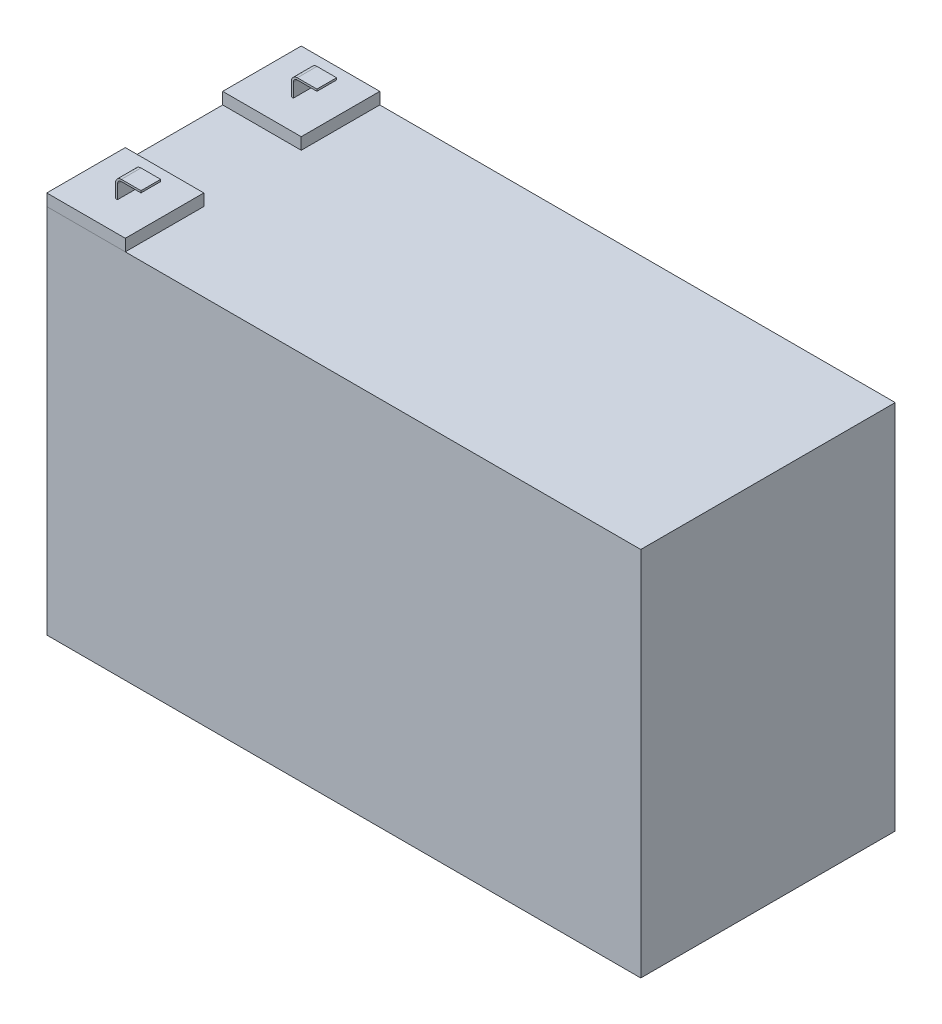
ISO-10303-21;
HEADER;
FILE_DESCRIPTION(('STEP AP214'),'2;1');
FILE_NAME('part.step','',(''),(''),'','','');
FILE_SCHEMA(('AUTOMOTIVE_DESIGN { 1 0 10303 214 1 1 1 1 }'));
ENDSEC;
DATA;
#1=APPLICATION_CONTEXT('core data for automotive mechanical design processes');
#2=APPLICATION_PROTOCOL_DEFINITION('international standard','automotive_design',2000,#1);
#3=PRODUCT_CONTEXT('',#1,'mechanical');
#4=PRODUCT('Part','Part','',(#3));
#5=PRODUCT_RELATED_PRODUCT_CATEGORY('part','',(#4));
#6=PRODUCT_DEFINITION_FORMATION('','',#4);
#7=PRODUCT_DEFINITION_CONTEXT('part definition',#1,'design');
#8=PRODUCT_DEFINITION('design','',#6,#7);
#9=PRODUCT_DEFINITION_SHAPE('','',#8);
#10=(LENGTH_UNIT() NAMED_UNIT(*) SI_UNIT(.MILLI.,.METRE.));
#11=(NAMED_UNIT(*) PLANE_ANGLE_UNIT() SI_UNIT($,.RADIAN.));
#12=(NAMED_UNIT(*) SI_UNIT($,.STERADIAN.) SOLID_ANGLE_UNIT());
#13=UNCERTAINTY_MEASURE_WITH_UNIT(LENGTH_MEASURE(1.E-05),#10,'distance_accuracy_value','');
#14=(GEOMETRIC_REPRESENTATION_CONTEXT(3) GLOBAL_UNCERTAINTY_ASSIGNED_CONTEXT((#13)) GLOBAL_UNIT_ASSIGNED_CONTEXT((#10,
#11,#12)) REPRESENTATION_CONTEXT('',''));
#15=CARTESIAN_POINT('',(0.,0.,0.));
#16=DIRECTION('',(0.,0.,1.));
#17=DIRECTION('',(1.,0.,0.));
#18=AXIS2_PLACEMENT_3D('',#15,#16,#17);
#19=CARTESIAN_POINT('',(-75.63,97.5,-32.4));
#20=DIRECTION('',(1.,0.,0.));
#21=DIRECTION('',(0.,0.,1.));
#22=AXIS2_PLACEMENT_3D('',#19,#20,#21);
#23=PLANE('',#22);
#24=DIRECTION('',(0.,0.,-1.));
#25=VECTOR('',#24,1.);
#26=CARTESIAN_POINT('',(-75.63,94.5,-32.4));
#27=LINE('',#26,#25);
#28=CARTESIAN_POINT('',(-75.63,94.5,-12.4));
#29=VERTEX_POINT('',#28);
#30=CARTESIAN_POINT('',(-75.63,94.5,-32.4));
#31=VERTEX_POINT('',#30);
#32=EDGE_CURVE('E115',#29,#31,#27,.T.);
#33=ORIENTED_EDGE('',*,*,#32,.F.);
#34=DIRECTION('',(0.,-1.,0.));
#35=VECTOR('',#34,1.);
#36=CARTESIAN_POINT('',(-75.63,97.5,-12.4));
#37=LINE('',#36,#35);
#38=CARTESIAN_POINT('',(-75.63,97.5,-12.4));
#39=VERTEX_POINT('',#38);
#40=EDGE_CURVE('E114',#39,#29,#37,.T.);
#41=ORIENTED_EDGE('',*,*,#40,.F.);
#42=DIRECTION('',(0.,0.,-1.));
#43=VECTOR('',#42,1.);
#44=CARTESIAN_POINT('',(-75.63,97.5,-32.4));
#45=LINE('',#44,#43);
#46=CARTESIAN_POINT('',(-75.63,97.5,-32.4));
#47=VERTEX_POINT('',#46);
#48=EDGE_CURVE('E109',#39,#47,#45,.T.);
#49=ORIENTED_EDGE('',*,*,#48,.T.);
#50=DIRECTION('',(0.,-1.,0.));
#51=VECTOR('',#50,1.);
#52=CARTESIAN_POINT('',(-75.63,97.5,-32.4));
#53=LINE('',#52,#51);
#54=EDGE_CURVE('E12',#47,#31,#53,.T.);
#55=ORIENTED_EDGE('',*,*,#54,.T.);
#56=EDGE_LOOP('',(#33,#41,#49,#55));
#57=FACE_BOUND('',#56,.T.);
#58=ADVANCED_FACE('F52',(#57),#23,.F.);
#59=CARTESIAN_POINT('',(-75.63,97.5,-32.4));
#60=DIRECTION('',(0.,0.,1.));
#61=DIRECTION('',(-1.,0.,0.));
#62=AXIS2_PLACEMENT_3D('',#59,#60,#61);
#63=PLANE('',#62);
#64=DIRECTION('',(1.,0.,0.));
#65=VECTOR('',#64,1.);
#66=CARTESIAN_POINT('',(-75.63,94.5,-32.4));
#67=LINE('',#66,#65);
#68=CARTESIAN_POINT('',(-55.63,94.5,-32.4));
#69=VERTEX_POINT('',#68);
#70=EDGE_CURVE('E117',#31,#69,#67,.T.);
#71=ORIENTED_EDGE('',*,*,#70,.F.);
#72=ORIENTED_EDGE('',*,*,#54,.F.);
#73=DIRECTION('',(1.,0.,0.));
#74=VECTOR('',#73,1.);
#75=CARTESIAN_POINT('',(-75.63,97.5,-32.4));
#76=LINE('',#75,#74);
#77=CARTESIAN_POINT('',(-55.63,97.5,-32.4));
#78=VERTEX_POINT('',#77);
#79=EDGE_CURVE('E93',#47,#78,#76,.T.);
#80=ORIENTED_EDGE('',*,*,#79,.T.);
#81=DIRECTION('',(0.,-1.,0.));
#82=VECTOR('',#81,1.);
#83=CARTESIAN_POINT('',(-55.63,97.5,-32.4));
#84=LINE('',#83,#82);
#85=EDGE_CURVE('E60',#78,#69,#84,.T.);
#86=ORIENTED_EDGE('',*,*,#85,.T.);
#87=EDGE_LOOP('',(#71,#72,#80,#86));
#88=FACE_BOUND('',#87,.T.);
#89=ADVANCED_FACE('F107',(#88),#63,.F.);
#90=CARTESIAN_POINT('',(-55.63,97.5,-32.4));
#91=DIRECTION('',(-1.,0.,0.));
#92=DIRECTION('',(0.,0.,-1.));
#93=AXIS2_PLACEMENT_3D('',#90,#91,#92);
#94=PLANE('',#93);
#95=DIRECTION('',(0.,0.,1.));
#96=VECTOR('',#95,1.);
#97=CARTESIAN_POINT('',(-55.63,94.5,-32.4));
#98=LINE('',#97,#96);
#99=CARTESIAN_POINT('',(-55.63,94.5,-12.4));
#100=VERTEX_POINT('',#99);
#101=EDGE_CURVE('E103',#69,#100,#98,.T.);
#102=ORIENTED_EDGE('',*,*,#101,.F.);
#103=ORIENTED_EDGE('',*,*,#85,.F.);
#104=DIRECTION('',(0.,0.,1.));
#105=VECTOR('',#104,1.);
#106=CARTESIAN_POINT('',(-55.63,97.5,-32.4));
#107=LINE('',#106,#105);
#108=CARTESIAN_POINT('',(-55.63,97.5,-12.4));
#109=VERTEX_POINT('',#108);
#110=EDGE_CURVE('E96',#78,#109,#107,.T.);
#111=ORIENTED_EDGE('',*,*,#110,.T.);
#112=DIRECTION('',(0.,-1.,0.));
#113=VECTOR('',#112,1.);
#114=CARTESIAN_POINT('',(-55.63,97.5,-12.4));
#115=LINE('',#114,#113);
#116=EDGE_CURVE('E106',#109,#100,#115,.T.);
#117=ORIENTED_EDGE('',*,*,#116,.T.);
#118=EDGE_LOOP('',(#102,#103,#111,#117));
#119=FACE_BOUND('',#118,.T.);
#120=ADVANCED_FACE('F102',(#119),#94,.F.);
#121=CARTESIAN_POINT('',(-75.63,97.5,-12.4));
#122=DIRECTION('',(0.,0.,-1.));
#123=DIRECTION('',(1.,0.,0.));
#124=AXIS2_PLACEMENT_3D('',#121,#122,#123);
#125=PLANE('',#124);
#126=DIRECTION('',(-1.,0.,0.));
#127=VECTOR('',#126,1.);
#128=CARTESIAN_POINT('',(-75.63,94.5,-12.4));
#129=LINE('',#128,#127);
#130=EDGE_CURVE('E82',#100,#29,#129,.T.);
#131=ORIENTED_EDGE('',*,*,#130,.F.);
#132=ORIENTED_EDGE('',*,*,#116,.F.);
#133=DIRECTION('',(-1.,0.,0.));
#134=VECTOR('',#133,1.);
#135=CARTESIAN_POINT('',(-75.63,97.5,-12.4));
#136=LINE('',#135,#134);
#137=EDGE_CURVE('E68',#109,#39,#136,.T.);
#138=ORIENTED_EDGE('',*,*,#137,.T.);
#139=ORIENTED_EDGE('',*,*,#40,.T.);
#140=EDGE_LOOP('',(#131,#132,#138,#139));
#141=FACE_BOUND('',#140,.T.);
#142=ADVANCED_FACE('F126',(#141),#125,.F.);
#143=CARTESIAN_POINT('',(0.,97.5,0.));
#144=DIRECTION('',(0.,-1.,0.));
#145=DIRECTION('',(0.,0.,1.));
#146=AXIS2_PLACEMENT_3D('',#143,#144,#145);
#147=PLANE('',#146);
#148=ORIENTED_EDGE('',*,*,#48,.F.);
#149=ORIENTED_EDGE('',*,*,#137,.F.);
#150=ORIENTED_EDGE('',*,*,#110,.F.);
#151=ORIENTED_EDGE('',*,*,#79,.F.);
#152=EDGE_LOOP('',(#148,#149,#150,#151));
#153=FACE_BOUND('',#152,.T.);
#154=ADVANCED_FACE('F98',(#153),#147,.F.);
#155=CARTESIAN_POINT('',(0.,94.5,0.));
#156=DIRECTION('',(0.,-1.,0.));
#157=DIRECTION('',(0.,0.,1.));
#158=AXIS2_PLACEMENT_3D('',#155,#156,#157);
#159=PLANE('',#158);
#160=ORIENTED_EDGE('',*,*,#32,.T.);
#161=ORIENTED_EDGE('',*,*,#70,.T.);
#162=ORIENTED_EDGE('',*,*,#101,.T.);
#163=ORIENTED_EDGE('',*,*,#130,.T.);
#164=EDGE_LOOP('',(#160,#161,#162,#163));
#165=FACE_BOUND('',#164,.T.);
#166=ADVANCED_FACE('F122',(#165),#159,.T.);
#167=CLOSED_SHELL('',(#58,#89,#120,#142,#154,#166));
#168=MANIFOLD_SOLID_BREP('B2',#167);
#169=CARTESIAN_POINT('',(-65.63,97.5,-19.9));
#170=DIRECTION('',(0.,-1.,0.));
#171=DIRECTION('',(0.,0.,1.));
#172=AXIS2_PLACEMENT_3D('',#169,#170,#171);
#173=PLANE('',#172);
#174=DIRECTION('',(0.,0.,-1.));
#175=VECTOR('',#174,1.);
#176=CARTESIAN_POINT('',(-65.13,97.5,-19.9));
#177=LINE('',#176,#175);
#178=CARTESIAN_POINT('',(-65.13,97.5,-19.9));
#179=VERTEX_POINT('',#178);
#180=CARTESIAN_POINT('',(-65.13,97.5,-24.9));
#181=VERTEX_POINT('',#180);
#182=EDGE_CURVE('E189',#179,#181,#177,.T.);
#183=ORIENTED_EDGE('',*,*,#182,.F.);
#184=DIRECTION('',(1.,0.,0.));
#185=VECTOR('',#184,1.);
#186=CARTESIAN_POINT('',(-65.63,97.5,-19.9));
#187=LINE('',#186,#185);
#188=CARTESIAN_POINT('',(-65.63,97.5,-19.9));
#189=VERTEX_POINT('',#188);
#190=EDGE_CURVE('E313',#189,#179,#187,.T.);
#191=ORIENTED_EDGE('',*,*,#190,.F.);
#192=DIRECTION('',(0.,0.,-1.));
#193=VECTOR('',#192,1.);
#194=CARTESIAN_POINT('',(-65.63,97.5,-19.9));
#195=LINE('',#194,#193);
#196=CARTESIAN_POINT('',(-65.63,97.5,-24.9));
#197=VERTEX_POINT('',#196);
#198=EDGE_CURVE('E50',#189,#197,#195,.T.);
#199=ORIENTED_EDGE('',*,*,#198,.T.);
#200=DIRECTION('',(1.,0.,0.));
#201=VECTOR('',#200,1.);
#202=CARTESIAN_POINT('',(-65.63,97.5,-24.9));
#203=LINE('',#202,#201);
#204=EDGE_CURVE('E256',#197,#181,#203,.T.);
#205=ORIENTED_EDGE('',*,*,#204,.T.);
#206=EDGE_LOOP('',(#183,#191,#199,#205));
#207=FACE_BOUND('',#206,.T.);
#208=ADVANCED_FACE('F186',(#207),#173,.T.);
#209=CARTESIAN_POINT('',(-65.63,97.5,-19.9));
#210=DIRECTION('',(-1.,0.,0.));
#211=DIRECTION('',(0.,0.,-1.));
#212=AXIS2_PLACEMENT_3D('',#209,#210,#211);
#213=PLANE('',#212);
#214=ORIENTED_EDGE('',*,*,#198,.F.);
#215=DIRECTION('',(0.,-1.,0.));
#216=VECTOR('',#215,1.);
#217=CARTESIAN_POINT('',(-65.63,97.5,-19.9));
#218=LINE('',#217,#216);
#219=CARTESIAN_POINT('',(-65.63,101.,-19.9));
#220=VERTEX_POINT('',#219);
#221=EDGE_CURVE('E202',#220,#189,#218,.T.);
#222=ORIENTED_EDGE('',*,*,#221,.F.);
#223=DIRECTION('',(0.,0.,-1.));
#224=VECTOR('',#223,1.);
#225=CARTESIAN_POINT('',(-65.63,101.,-19.9));
#226=LINE('',#225,#224);
#227=CARTESIAN_POINT('',(-65.63,101.,-24.9));
#228=VERTEX_POINT('',#227);
#229=EDGE_CURVE('E194',#220,#228,#226,.T.);
#230=ORIENTED_EDGE('',*,*,#229,.T.);
#231=DIRECTION('',(0.,-1.,0.));
#232=VECTOR('',#231,1.);
#233=CARTESIAN_POINT('',(-65.63,97.5,-24.9));
#234=LINE('',#233,#232);
#235=EDGE_CURVE('E311',#228,#197,#234,.T.);
#236=ORIENTED_EDGE('',*,*,#235,.T.);
#237=EDGE_LOOP('',(#214,#222,#230,#236));
#238=FACE_BOUND('',#237,.T.);
#239=ADVANCED_FACE('F330',(#238),#213,.T.);
#240=CARTESIAN_POINT('',(-64.13,101.,-19.9));
#241=DIRECTION('',(0.,0.,-1.));
#242=DIRECTION('',(1.,0.,0.));
#243=AXIS2_PLACEMENT_3D('',#240,#241,#242);
#244=CYLINDRICAL_SURFACE('',#243,1.49999999999999);
#245=ORIENTED_EDGE('',*,*,#229,.F.);
#246=CARTESIAN_POINT('',(-64.13,101.,-19.9));
#247=DIRECTION('',(0.,0.,1.));
#248=DIRECTION('',(-1.,0.,0.));
#249=AXIS2_PLACEMENT_3D('',#246,#247,#248);
#250=CIRCLE('',#249,1.49999999999999);
#251=CARTESIAN_POINT('',(-64.13,102.5,-19.9));
#252=VERTEX_POINT('',#251);
#253=EDGE_CURVE('E207',#252,#220,#250,.T.);
#254=ORIENTED_EDGE('',*,*,#253,.F.);
#255=DIRECTION('',(0.,0.,-1.));
#256=VECTOR('',#255,1.);
#257=CARTESIAN_POINT('',(-64.13,102.5,-19.9));
#258=LINE('',#257,#256);
#259=CARTESIAN_POINT('',(-64.13,102.5,-24.9));
#260=VERTEX_POINT('',#259);
#261=EDGE_CURVE('E279',#252,#260,#258,.T.);
#262=ORIENTED_EDGE('',*,*,#261,.T.);
#263=CARTESIAN_POINT('',(-64.13,101.,-24.9));
#264=DIRECTION('',(0.,0.,1.));
#265=DIRECTION('',(-1.,0.,0.));
#266=AXIS2_PLACEMENT_3D('',#263,#264,#265);
#267=CIRCLE('',#266,1.49999999999999);
#268=EDGE_CURVE('E309',#260,#228,#267,.T.);
#269=ORIENTED_EDGE('',*,*,#268,.T.);
#270=EDGE_LOOP('',(#245,#254,#262,#269));
#271=FACE_BOUND('',#270,.T.);
#272=ADVANCED_FACE('F328',(#271),#244,.T.);
#273=CARTESIAN_POINT('',(-64.13,102.5,-19.9));
#274=DIRECTION('',(0.,1.,0.));
#275=DIRECTION('',(-1.,0.,0.));
#276=AXIS2_PLACEMENT_3D('',#273,#274,#275);
#277=PLANE('',#276);
#278=ORIENTED_EDGE('',*,*,#261,.F.);
#279=DIRECTION('',(-1.,0.,0.));
#280=VECTOR('',#279,1.);
#281=CARTESIAN_POINT('',(-64.13,102.5,-19.9));
#282=LINE('',#281,#280);
#283=CARTESIAN_POINT('',(-59.13,102.5,-19.9));
#284=VERTEX_POINT('',#283);
#285=EDGE_CURVE('E273',#284,#252,#282,.T.);
#286=ORIENTED_EDGE('',*,*,#285,.F.);
#287=DIRECTION('',(0.,0.,-1.));
#288=VECTOR('',#287,1.);
#289=CARTESIAN_POINT('',(-59.13,102.5,-19.9));
#290=LINE('',#289,#288);
#291=CARTESIAN_POINT('',(-59.13,102.5,-24.9));
#292=VERTEX_POINT('',#291);
#293=EDGE_CURVE('E282',#284,#292,#290,.T.);
#294=ORIENTED_EDGE('',*,*,#293,.T.);
#295=DIRECTION('',(-1.,0.,0.));
#296=VECTOR('',#295,1.);
#297=CARTESIAN_POINT('',(-64.13,102.5,-24.9));
#298=LINE('',#297,#296);
#299=EDGE_CURVE('E305',#292,#260,#298,.T.);
#300=ORIENTED_EDGE('',*,*,#299,.T.);
#301=EDGE_LOOP('',(#278,#286,#294,#300));
#302=FACE_BOUND('',#301,.T.);
#303=ADVANCED_FACE('F325',(#302),#277,.T.);
#304=CARTESIAN_POINT('',(-59.13,102.5,-19.9));
#305=DIRECTION('',(1.,0.,0.));
#306=DIRECTION('',(0.,0.,1.));
#307=AXIS2_PLACEMENT_3D('',#304,#305,#306);
#308=PLANE('',#307);
#309=ORIENTED_EDGE('',*,*,#293,.F.);
#310=DIRECTION('',(0.,1.,0.));
#311=VECTOR('',#310,1.);
#312=CARTESIAN_POINT('',(-59.13,102.5,-19.9));
#313=LINE('',#312,#311);
#314=CARTESIAN_POINT('',(-59.13,102.,-19.9));
#315=VERTEX_POINT('',#314);
#316=EDGE_CURVE('E318',#315,#284,#313,.T.);
#317=ORIENTED_EDGE('',*,*,#316,.F.);
#318=DIRECTION('',(0.,0.,-1.));
#319=VECTOR('',#318,1.);
#320=CARTESIAN_POINT('',(-59.13,102.,-19.9));
#321=LINE('',#320,#319);
#322=CARTESIAN_POINT('',(-59.13,102.,-24.9));
#323=VERTEX_POINT('',#322);
#324=EDGE_CURVE('E285',#315,#323,#321,.T.);
#325=ORIENTED_EDGE('',*,*,#324,.T.);
#326=DIRECTION('',(0.,1.,0.));
#327=VECTOR('',#326,1.);
#328=CARTESIAN_POINT('',(-59.13,102.5,-24.9));
#329=LINE('',#328,#327);
#330=EDGE_CURVE('E303',#323,#292,#329,.T.);
#331=ORIENTED_EDGE('',*,*,#330,.T.);
#332=EDGE_LOOP('',(#309,#317,#325,#331));
#333=FACE_BOUND('',#332,.T.);
#334=ADVANCED_FACE('F332',(#333),#308,.T.);
#335=CARTESIAN_POINT('',(-64.13,102.,-19.9));
#336=DIRECTION('',(0.,-1.,0.));
#337=DIRECTION('',(0.,0.,1.));
#338=AXIS2_PLACEMENT_3D('',#335,#336,#337);
#339=PLANE('',#338);
#340=ORIENTED_EDGE('',*,*,#324,.F.);
#341=DIRECTION('',(1.,0.,0.));
#342=VECTOR('',#341,1.);
#343=CARTESIAN_POINT('',(-64.13,102.,-19.9));
#344=LINE('',#343,#342);
#345=CARTESIAN_POINT('',(-64.13,102.,-19.9));
#346=VERTEX_POINT('',#345);
#347=EDGE_CURVE('E296',#346,#315,#344,.T.);
#348=ORIENTED_EDGE('',*,*,#347,.F.);
#349=DIRECTION('',(0.,0.,-1.));
#350=VECTOR('',#349,1.);
#351=CARTESIAN_POINT('',(-64.13,102.,-19.9));
#352=LINE('',#351,#350);
#353=CARTESIAN_POINT('',(-64.13,102.,-24.9));
#354=VERTEX_POINT('',#353);
#355=EDGE_CURVE('E271',#346,#354,#352,.T.);
#356=ORIENTED_EDGE('',*,*,#355,.T.);
#357=DIRECTION('',(1.,0.,0.));
#358=VECTOR('',#357,1.);
#359=CARTESIAN_POINT('',(-64.13,102.,-24.9));
#360=LINE('',#359,#358);
#361=EDGE_CURVE('E294',#354,#323,#360,.T.);
#362=ORIENTED_EDGE('',*,*,#361,.T.);
#363=EDGE_LOOP('',(#340,#348,#356,#362));
#364=FACE_BOUND('',#363,.T.);
#365=ADVANCED_FACE('F293',(#364),#339,.T.);
#366=CARTESIAN_POINT('',(-64.13,101.,-19.9));
#367=DIRECTION('',(0.,0.,-1.));
#368=DIRECTION('',(1.,0.,0.));
#369=AXIS2_PLACEMENT_3D('',#366,#367,#368);
#370=CYLINDRICAL_SURFACE('',#369,1.);
#371=ORIENTED_EDGE('',*,*,#355,.F.);
#372=CARTESIAN_POINT('',(-64.13,101.,-19.9));
#373=DIRECTION('',(0.,0.,-1.));
#374=DIRECTION('',(-1.,0.,0.));
#375=AXIS2_PLACEMENT_3D('',#372,#373,#374);
#376=CIRCLE('',#375,1.);
#377=CARTESIAN_POINT('',(-65.13,101.,-19.9));
#378=VERTEX_POINT('',#377);
#379=EDGE_CURVE('E300',#378,#346,#376,.T.);
#380=ORIENTED_EDGE('',*,*,#379,.F.);
#381=DIRECTION('',(0.,0.,-1.));
#382=VECTOR('',#381,1.);
#383=CARTESIAN_POINT('',(-65.13,101.,-19.9));
#384=LINE('',#383,#382);
#385=CARTESIAN_POINT('',(-65.13,101.,-24.9));
#386=VERTEX_POINT('',#385);
#387=EDGE_CURVE('E270',#378,#386,#384,.T.);
#388=ORIENTED_EDGE('',*,*,#387,.T.);
#389=CARTESIAN_POINT('',(-64.13,101.,-24.9));
#390=DIRECTION('',(0.,0.,-1.));
#391=DIRECTION('',(-1.,0.,0.));
#392=AXIS2_PLACEMENT_3D('',#389,#390,#391);
#393=CIRCLE('',#392,1.);
#394=EDGE_CURVE('E258',#386,#354,#393,.T.);
#395=ORIENTED_EDGE('',*,*,#394,.T.);
#396=EDGE_LOOP('',(#371,#380,#388,#395));
#397=FACE_BOUND('',#396,.T.);
#398=ADVANCED_FACE('F299',(#397),#370,.F.);
#399=CARTESIAN_POINT('',(-65.13,97.5,-19.9));
#400=DIRECTION('',(1.,0.,0.));
#401=DIRECTION('',(0.,0.,1.));
#402=AXIS2_PLACEMENT_3D('',#399,#400,#401);
#403=PLANE('',#402);
#404=ORIENTED_EDGE('',*,*,#387,.F.);
#405=DIRECTION('',(0.,1.,0.));
#406=VECTOR('',#405,1.);
#407=CARTESIAN_POINT('',(-65.13,97.5,-19.9));
#408=LINE('',#407,#406);
#409=EDGE_CURVE('E269',#179,#378,#408,.T.);
#410=ORIENTED_EDGE('',*,*,#409,.F.);
#411=ORIENTED_EDGE('',*,*,#182,.T.);
#412=DIRECTION('',(0.,1.,0.));
#413=VECTOR('',#412,1.);
#414=CARTESIAN_POINT('',(-65.13,97.5,-24.9));
#415=LINE('',#414,#413);
#416=EDGE_CURVE('E252',#181,#386,#415,.T.);
#417=ORIENTED_EDGE('',*,*,#416,.T.);
#418=EDGE_LOOP('',(#404,#410,#411,#417));
#419=FACE_BOUND('',#418,.T.);
#420=ADVANCED_FACE('F268',(#419),#403,.T.);
#421=CARTESIAN_POINT('',(-64.13,101.,-19.9));
#422=DIRECTION('',(0.,0.,1.));
#423=DIRECTION('',(-1.,0.,0.));
#424=AXIS2_PLACEMENT_3D('',#421,#422,#423);
#425=PLANE('',#424);
#426=ORIENTED_EDGE('',*,*,#190,.T.);
#427=ORIENTED_EDGE('',*,*,#409,.T.);
#428=ORIENTED_EDGE('',*,*,#379,.T.);
#429=ORIENTED_EDGE('',*,*,#347,.T.);
#430=ORIENTED_EDGE('',*,*,#316,.T.);
#431=ORIENTED_EDGE('',*,*,#285,.T.);
#432=ORIENTED_EDGE('',*,*,#253,.T.);
#433=ORIENTED_EDGE('',*,*,#221,.T.);
#434=EDGE_LOOP('',(#426,#427,#428,#429,#430,#431,#432,#433));
#435=FACE_BOUND('',#434,.T.);
#436=ADVANCED_FACE('F321',(#435),#425,.T.);
#437=CARTESIAN_POINT('',(-64.13,101.,-24.9));
#438=DIRECTION('',(0.,0.,1.));
#439=DIRECTION('',(-1.,0.,0.));
#440=AXIS2_PLACEMENT_3D('',#437,#438,#439);
#441=PLANE('',#440);
#442=ORIENTED_EDGE('',*,*,#204,.F.);
#443=ORIENTED_EDGE('',*,*,#235,.F.);
#444=ORIENTED_EDGE('',*,*,#268,.F.);
#445=ORIENTED_EDGE('',*,*,#299,.F.);
#446=ORIENTED_EDGE('',*,*,#330,.F.);
#447=ORIENTED_EDGE('',*,*,#361,.F.);
#448=ORIENTED_EDGE('',*,*,#394,.F.);
#449=ORIENTED_EDGE('',*,*,#416,.F.);
#450=EDGE_LOOP('',(#442,#443,#444,#445,#446,#447,#448,#449));
#451=FACE_BOUND('',#450,.T.);
#452=ADVANCED_FACE('F254',(#451),#441,.F.);
#453=CLOSED_SHELL('',(#208,#239,#272,#303,#334,#365,#398,#420,#436,#452));
#454=MANIFOLD_SOLID_BREP('B6',#453);
#455=CARTESIAN_POINT('',(-65.63,97.5,19.9));
#456=DIRECTION('',(0.,-1.,0.));
#457=DIRECTION('',(0.,0.,-1.));
#458=AXIS2_PLACEMENT_3D('',#455,#456,#457);
#459=PLANE('',#458);
#460=DIRECTION('',(0.,0.,1.));
#461=VECTOR('',#460,1.);
#462=CARTESIAN_POINT('',(-65.13,97.5,19.9));
#463=LINE('',#462,#461);
#464=CARTESIAN_POINT('',(-65.13,97.5,19.9));
#465=VERTEX_POINT('',#464);
#466=CARTESIAN_POINT('',(-65.13,97.5,24.9));
#467=VERTEX_POINT('',#466);
#468=EDGE_CURVE('E427',#465,#467,#463,.T.);
#469=ORIENTED_EDGE('',*,*,#468,.T.);
#470=DIRECTION('',(1.,0.,0.));
#471=VECTOR('',#470,1.);
#472=CARTESIAN_POINT('',(-65.63,97.5,24.9));
#473=LINE('',#472,#471);
#474=CARTESIAN_POINT('',(-65.63,97.5,24.9));
#475=VERTEX_POINT('',#474);
#476=EDGE_CURVE('E488',#475,#467,#473,.T.);
#477=ORIENTED_EDGE('',*,*,#476,.F.);
#478=DIRECTION('',(0.,0.,1.));
#479=VECTOR('',#478,1.);
#480=CARTESIAN_POINT('',(-65.63,97.5,19.9));
#481=LINE('',#480,#479);
#482=CARTESIAN_POINT('',(-65.63,97.5,19.9));
#483=VERTEX_POINT('',#482);
#484=EDGE_CURVE('E184',#483,#475,#481,.T.);
#485=ORIENTED_EDGE('',*,*,#484,.F.);
#486=DIRECTION('',(1.,0.,0.));
#487=VECTOR('',#486,1.);
#488=CARTESIAN_POINT('',(-65.63,97.5,19.9));
#489=LINE('',#488,#487);
#490=EDGE_CURVE('E489',#483,#465,#489,.T.);
#491=ORIENTED_EDGE('',*,*,#490,.T.);
#492=EDGE_LOOP('',(#469,#477,#485,#491));
#493=FACE_BOUND('',#492,.T.);
#494=ADVANCED_FACE('F424',(#493),#459,.T.);
#495=CARTESIAN_POINT('',(-65.63,97.5,19.9));
#496=DIRECTION('',(-1.,0.,0.));
#497=DIRECTION('',(0.,0.,1.));
#498=AXIS2_PLACEMENT_3D('',#495,#496,#497);
#499=PLANE('',#498);
#500=ORIENTED_EDGE('',*,*,#484,.T.);
#501=DIRECTION('',(0.,-1.,0.));
#502=VECTOR('',#501,1.);
#503=CARTESIAN_POINT('',(-65.63,97.5,24.9));
#504=LINE('',#503,#502);
#505=CARTESIAN_POINT('',(-65.63,101.,24.9));
#506=VERTEX_POINT('',#505);
#507=EDGE_CURVE('E506',#506,#475,#504,.T.);
#508=ORIENTED_EDGE('',*,*,#507,.F.);
#509=DIRECTION('',(0.,0.,1.));
#510=VECTOR('',#509,1.);
#511=CARTESIAN_POINT('',(-65.63,101.,19.9));
#512=LINE('',#511,#510);
#513=CARTESIAN_POINT('',(-65.63,101.,19.9));
#514=VERTEX_POINT('',#513);
#515=EDGE_CURVE('E432',#514,#506,#512,.T.);
#516=ORIENTED_EDGE('',*,*,#515,.F.);
#517=DIRECTION('',(0.,-1.,0.));
#518=VECTOR('',#517,1.);
#519=CARTESIAN_POINT('',(-65.63,97.5,19.9));
#520=LINE('',#519,#518);
#521=EDGE_CURVE('E494',#514,#483,#520,.T.);
#522=ORIENTED_EDGE('',*,*,#521,.T.);
#523=EDGE_LOOP('',(#500,#508,#516,#522));
#524=FACE_BOUND('',#523,.T.);
#525=ADVANCED_FACE('F570',(#524),#499,.T.);
#526=CARTESIAN_POINT('',(-64.13,101.,19.9));
#527=DIRECTION('',(0.,0.,1.));
#528=DIRECTION('',(1.,0.,0.));
#529=AXIS2_PLACEMENT_3D('',#526,#527,#528);
#530=CYLINDRICAL_SURFACE('',#529,1.49999999999999);
#531=ORIENTED_EDGE('',*,*,#515,.T.);
#532=CARTESIAN_POINT('',(-64.13,101.,24.9));
#533=DIRECTION('',(0.,0.,1.));
#534=DIRECTION('',(-1.,0.,0.));
#535=AXIS2_PLACEMENT_3D('',#532,#533,#534);
#536=CIRCLE('',#535,1.49999999999999);
#537=CARTESIAN_POINT('',(-64.13,102.5,24.9));
#538=VERTEX_POINT('',#537);
#539=EDGE_CURVE('E519',#538,#506,#536,.T.);
#540=ORIENTED_EDGE('',*,*,#539,.F.);
#541=DIRECTION('',(0.,0.,1.));
#542=VECTOR('',#541,1.);
#543=CARTESIAN_POINT('',(-64.13,102.5,19.9));
#544=LINE('',#543,#542);
#545=CARTESIAN_POINT('',(-64.13,102.5,19.9));
#546=VERTEX_POINT('',#545);
#547=EDGE_CURVE('E541',#546,#538,#544,.T.);
#548=ORIENTED_EDGE('',*,*,#547,.F.);
#549=CARTESIAN_POINT('',(-64.13,101.,19.9));
#550=DIRECTION('',(0.,0.,1.));
#551=DIRECTION('',(-1.,0.,0.));
#552=AXIS2_PLACEMENT_3D('',#549,#550,#551);
#553=CIRCLE('',#552,1.49999999999999);
#554=EDGE_CURVE('E537',#546,#514,#553,.T.);
#555=ORIENTED_EDGE('',*,*,#554,.T.);
#556=EDGE_LOOP('',(#531,#540,#548,#555));
#557=FACE_BOUND('',#556,.T.);
#558=ADVANCED_FACE('F569',(#557),#530,.T.);
#559=CARTESIAN_POINT('',(-64.13,102.5,19.9));
#560=DIRECTION('',(0.,1.,0.));
#561=DIRECTION('',(-1.,0.,0.));
#562=AXIS2_PLACEMENT_3D('',#559,#560,#561);
#563=PLANE('',#562);
#564=ORIENTED_EDGE('',*,*,#547,.T.);
#565=DIRECTION('',(-1.,0.,0.));
#566=VECTOR('',#565,1.);
#567=CARTESIAN_POINT('',(-64.13,102.5,24.9));
#568=LINE('',#567,#566);
#569=CARTESIAN_POINT('',(-59.13,102.5,24.9));
#570=VERTEX_POINT('',#569);
#571=EDGE_CURVE('E516',#570,#538,#568,.T.);
#572=ORIENTED_EDGE('',*,*,#571,.F.);
#573=DIRECTION('',(0.,0.,1.));
#574=VECTOR('',#573,1.);
#575=CARTESIAN_POINT('',(-59.13,102.5,19.9));
#576=LINE('',#575,#574);
#577=CARTESIAN_POINT('',(-59.13,102.5,19.9));
#578=VERTEX_POINT('',#577);
#579=EDGE_CURVE('E543',#578,#570,#576,.T.);
#580=ORIENTED_EDGE('',*,*,#579,.F.);
#581=DIRECTION('',(-1.,0.,0.));
#582=VECTOR('',#581,1.);
#583=CARTESIAN_POINT('',(-64.13,102.5,19.9));
#584=LINE('',#583,#582);
#585=EDGE_CURVE('E534',#578,#546,#584,.T.);
#586=ORIENTED_EDGE('',*,*,#585,.T.);
#587=EDGE_LOOP('',(#564,#572,#580,#586));
#588=FACE_BOUND('',#587,.T.);
#589=ADVANCED_FACE('F565',(#588),#563,.T.);
#590=CARTESIAN_POINT('',(-59.13,102.5,19.9));
#591=DIRECTION('',(1.,0.,0.));
#592=DIRECTION('',(0.,0.,-1.));
#593=AXIS2_PLACEMENT_3D('',#590,#591,#592);
#594=PLANE('',#593);
#595=ORIENTED_EDGE('',*,*,#579,.T.);
#596=DIRECTION('',(0.,1.,0.));
#597=VECTOR('',#596,1.);
#598=CARTESIAN_POINT('',(-59.13,102.5,24.9));
#599=LINE('',#598,#597);
#600=CARTESIAN_POINT('',(-59.13,102.,24.9));
#601=VERTEX_POINT('',#600);
#602=EDGE_CURVE('E513',#601,#570,#599,.T.);
#603=ORIENTED_EDGE('',*,*,#602,.F.);
#604=DIRECTION('',(0.,0.,1.));
#605=VECTOR('',#604,1.);
#606=CARTESIAN_POINT('',(-59.13,102.,19.9));
#607=LINE('',#606,#605);
#608=CARTESIAN_POINT('',(-59.13,102.,19.9));
#609=VERTEX_POINT('',#608);
#610=EDGE_CURVE('E545',#609,#601,#607,.T.);
#611=ORIENTED_EDGE('',*,*,#610,.F.);
#612=DIRECTION('',(0.,1.,0.));
#613=VECTOR('',#612,1.);
#614=CARTESIAN_POINT('',(-59.13,102.5,19.9));
#615=LINE('',#614,#613);
#616=EDGE_CURVE('E531',#609,#578,#615,.T.);
#617=ORIENTED_EDGE('',*,*,#616,.T.);
#618=EDGE_LOOP('',(#595,#603,#611,#617));
#619=FACE_BOUND('',#618,.T.);
#620=ADVANCED_FACE('F558',(#619),#594,.T.);
#621=CARTESIAN_POINT('',(-64.13,102.,19.9));
#622=DIRECTION('',(0.,-1.,0.));
#623=DIRECTION('',(0.,0.,-1.));
#624=AXIS2_PLACEMENT_3D('',#621,#622,#623);
#625=PLANE('',#624);
#626=ORIENTED_EDGE('',*,*,#610,.T.);
#627=DIRECTION('',(1.,0.,0.));
#628=VECTOR('',#627,1.);
#629=CARTESIAN_POINT('',(-64.13,102.,24.9));
#630=LINE('',#629,#628);
#631=CARTESIAN_POINT('',(-64.13,102.,24.9));
#632=VERTEX_POINT('',#631);
#633=EDGE_CURVE('E510',#632,#601,#630,.T.);
#634=ORIENTED_EDGE('',*,*,#633,.F.);
#635=DIRECTION('',(0.,0.,1.));
#636=VECTOR('',#635,1.);
#637=CARTESIAN_POINT('',(-64.13,102.,19.9));
#638=LINE('',#637,#636);
#639=CARTESIAN_POINT('',(-64.13,102.,19.9));
#640=VERTEX_POINT('',#639);
#641=EDGE_CURVE('E547',#640,#632,#638,.T.);
#642=ORIENTED_EDGE('',*,*,#641,.F.);
#643=DIRECTION('',(1.,0.,0.));
#644=VECTOR('',#643,1.);
#645=CARTESIAN_POINT('',(-64.13,102.,19.9));
#646=LINE('',#645,#644);
#647=EDGE_CURVE('E528',#640,#609,#646,.T.);
#648=ORIENTED_EDGE('',*,*,#647,.T.);
#649=EDGE_LOOP('',(#626,#634,#642,#648));
#650=FACE_BOUND('',#649,.T.);
#651=ADVANCED_FACE('F555',(#650),#625,.T.);
#652=CARTESIAN_POINT('',(-64.13,101.,19.9));
#653=DIRECTION('',(0.,0.,1.));
#654=DIRECTION('',(1.,0.,0.));
#655=AXIS2_PLACEMENT_3D('',#652,#653,#654);
#656=CYLINDRICAL_SURFACE('',#655,1.);
#657=ORIENTED_EDGE('',*,*,#641,.T.);
#658=CARTESIAN_POINT('',(-64.13,101.,24.9));
#659=DIRECTION('',(0.,0.,-1.));
#660=DIRECTION('',(-1.,0.,0.));
#661=AXIS2_PLACEMENT_3D('',#658,#659,#660);
#662=CIRCLE('',#661,1.);
#663=CARTESIAN_POINT('',(-65.13,101.,24.9));
#664=VERTEX_POINT('',#663);
#665=EDGE_CURVE('E501',#664,#632,#662,.T.);
#666=ORIENTED_EDGE('',*,*,#665,.F.);
#667=DIRECTION('',(0.,0.,1.));
#668=VECTOR('',#667,1.);
#669=CARTESIAN_POINT('',(-65.13,101.,19.9));
#670=LINE('',#669,#668);
#671=CARTESIAN_POINT('',(-65.13,101.,19.9));
#672=VERTEX_POINT('',#671);
#673=EDGE_CURVE('E493',#672,#664,#670,.T.);
#674=ORIENTED_EDGE('',*,*,#673,.F.);
#675=CARTESIAN_POINT('',(-64.13,101.,19.9));
#676=DIRECTION('',(0.,0.,-1.));
#677=DIRECTION('',(-1.,0.,0.));
#678=AXIS2_PLACEMENT_3D('',#675,#676,#677);
#679=CIRCLE('',#678,1.);
#680=EDGE_CURVE('E525',#672,#640,#679,.T.);
#681=ORIENTED_EDGE('',*,*,#680,.T.);
#682=EDGE_LOOP('',(#657,#666,#674,#681));
#683=FACE_BOUND('',#682,.T.);
#684=ADVANCED_FACE('F549',(#683),#656,.F.);
#685=CARTESIAN_POINT('',(-65.13,97.5,19.9));
#686=DIRECTION('',(1.,0.,0.));
#687=DIRECTION('',(0.,0.,-1.));
#688=AXIS2_PLACEMENT_3D('',#685,#686,#687);
#689=PLANE('',#688);
#690=ORIENTED_EDGE('',*,*,#673,.T.);
#691=DIRECTION('',(0.,1.,0.));
#692=VECTOR('',#691,1.);
#693=CARTESIAN_POINT('',(-65.13,97.5,24.9));
#694=LINE('',#693,#692);
#695=EDGE_CURVE('E496',#467,#664,#694,.T.);
#696=ORIENTED_EDGE('',*,*,#695,.F.);
#697=ORIENTED_EDGE('',*,*,#468,.F.);
#698=DIRECTION('',(0.,1.,0.));
#699=VECTOR('',#698,1.);
#700=CARTESIAN_POINT('',(-65.13,97.5,19.9));
#701=LINE('',#700,#699);
#702=EDGE_CURVE('E523',#465,#672,#701,.T.);
#703=ORIENTED_EDGE('',*,*,#702,.T.);
#704=EDGE_LOOP('',(#690,#696,#697,#703));
#705=FACE_BOUND('',#704,.T.);
#706=ADVANCED_FACE('F497',(#705),#689,.T.);
#707=CARTESIAN_POINT('',(-64.13,101.,19.9));
#708=DIRECTION('',(0.,0.,-1.));
#709=DIRECTION('',(-1.,0.,0.));
#710=AXIS2_PLACEMENT_3D('',#707,#708,#709);
#711=PLANE('',#710);
#712=ORIENTED_EDGE('',*,*,#490,.F.);
#713=ORIENTED_EDGE('',*,*,#521,.F.);
#714=ORIENTED_EDGE('',*,*,#554,.F.);
#715=ORIENTED_EDGE('',*,*,#585,.F.);
#716=ORIENTED_EDGE('',*,*,#616,.F.);
#717=ORIENTED_EDGE('',*,*,#647,.F.);
#718=ORIENTED_EDGE('',*,*,#680,.F.);
#719=ORIENTED_EDGE('',*,*,#702,.F.);
#720=EDGE_LOOP('',(#712,#713,#714,#715,#716,#717,#718,#719));
#721=FACE_BOUND('',#720,.T.);
#722=ADVANCED_FACE('F561',(#721),#711,.T.);
#723=CARTESIAN_POINT('',(-64.13,101.,24.9));
#724=DIRECTION('',(0.,0.,-1.));
#725=DIRECTION('',(-1.,0.,0.));
#726=AXIS2_PLACEMENT_3D('',#723,#724,#725);
#727=PLANE('',#726);
#728=ORIENTED_EDGE('',*,*,#476,.T.);
#729=ORIENTED_EDGE('',*,*,#695,.T.);
#730=ORIENTED_EDGE('',*,*,#665,.T.);
#731=ORIENTED_EDGE('',*,*,#633,.T.);
#732=ORIENTED_EDGE('',*,*,#602,.T.);
#733=ORIENTED_EDGE('',*,*,#571,.T.);
#734=ORIENTED_EDGE('',*,*,#539,.T.);
#735=ORIENTED_EDGE('',*,*,#507,.T.);
#736=EDGE_LOOP('',(#728,#729,#730,#731,#732,#733,#734,#735));
#737=FACE_BOUND('',#736,.T.);
#738=ADVANCED_FACE('F504',(#737),#727,.F.);
#739=CLOSED_SHELL('',(#494,#525,#558,#589,#620,#651,#684,#706,#722,#738));
#740=MANIFOLD_SOLID_BREP('B44',#739);
#741=CARTESIAN_POINT('',(-75.63,97.5,32.4));
#742=DIRECTION('',(1.,0.,0.));
#743=DIRECTION('',(0.,0.,-1.));
#744=AXIS2_PLACEMENT_3D('',#741,#742,#743);
#745=PLANE('',#744);
#746=DIRECTION('',(0.,0.,1.));
#747=VECTOR('',#746,1.);
#748=CARTESIAN_POINT('',(-75.63,94.5,32.4));
#749=LINE('',#748,#747);
#750=CARTESIAN_POINT('',(-75.63,94.5,12.4));
#751=VERTEX_POINT('',#750);
#752=CARTESIAN_POINT('',(-75.63,94.5,32.4));
#753=VERTEX_POINT('',#752);
#754=EDGE_CURVE('E724',#751,#753,#749,.T.);
#755=ORIENTED_EDGE('',*,*,#754,.T.);
#756=DIRECTION('',(0.,-1.,0.));
#757=VECTOR('',#756,1.);
#758=CARTESIAN_POINT('',(-75.63,97.5,32.4));
#759=LINE('',#758,#757);
#760=CARTESIAN_POINT('',(-75.63,97.5,32.4));
#761=VERTEX_POINT('',#760);
#762=EDGE_CURVE('E422',#761,#753,#759,.T.);
#763=ORIENTED_EDGE('',*,*,#762,.F.);
#764=DIRECTION('',(0.,0.,1.));
#765=VECTOR('',#764,1.);
#766=CARTESIAN_POINT('',(-75.63,97.5,32.4));
#767=LINE('',#766,#765);
#768=CARTESIAN_POINT('',(-75.63,97.5,12.4));
#769=VERTEX_POINT('',#768);
#770=EDGE_CURVE('E712',#769,#761,#767,.T.);
#771=ORIENTED_EDGE('',*,*,#770,.F.);
#772=DIRECTION('',(0.,-1.,0.));
#773=VECTOR('',#772,1.);
#774=CARTESIAN_POINT('',(-75.63,97.5,12.4));
#775=LINE('',#774,#773);
#776=EDGE_CURVE('E720',#769,#751,#775,.T.);
#777=ORIENTED_EDGE('',*,*,#776,.T.);
#778=EDGE_LOOP('',(#755,#763,#771,#777));
#779=FACE_BOUND('',#778,.T.);
#780=ADVANCED_FACE('F661',(#779),#745,.F.);
#781=CARTESIAN_POINT('',(-75.63,97.5,32.4));
#782=DIRECTION('',(0.,0.,-1.));
#783=DIRECTION('',(-1.,0.,0.));
#784=AXIS2_PLACEMENT_3D('',#781,#782,#783);
#785=PLANE('',#784);
#786=DIRECTION('',(1.,0.,0.));
#787=VECTOR('',#786,1.);
#788=CARTESIAN_POINT('',(-75.63,94.5,32.4));
#789=LINE('',#788,#787);
#790=CARTESIAN_POINT('',(-55.63,94.5,32.4));
#791=VERTEX_POINT('',#790);
#792=EDGE_CURVE('E716',#753,#791,#789,.T.);
#793=ORIENTED_EDGE('',*,*,#792,.T.);
#794=DIRECTION('',(0.,-1.,0.));
#795=VECTOR('',#794,1.);
#796=CARTESIAN_POINT('',(-55.63,97.5,32.4));
#797=LINE('',#796,#795);
#798=CARTESIAN_POINT('',(-55.63,97.5,32.4));
#799=VERTEX_POINT('',#798);
#800=EDGE_CURVE('E669',#799,#791,#797,.T.);
#801=ORIENTED_EDGE('',*,*,#800,.F.);
#802=DIRECTION('',(1.,0.,0.));
#803=VECTOR('',#802,1.);
#804=CARTESIAN_POINT('',(-75.63,97.5,32.4));
#805=LINE('',#804,#803);
#806=EDGE_CURVE('E707',#761,#799,#805,.T.);
#807=ORIENTED_EDGE('',*,*,#806,.F.);
#808=ORIENTED_EDGE('',*,*,#762,.T.);
#809=EDGE_LOOP('',(#793,#801,#807,#808));
#810=FACE_BOUND('',#809,.T.);
#811=ADVANCED_FACE('F715',(#810),#785,.F.);
#812=CARTESIAN_POINT('',(-55.63,97.5,32.4));
#813=DIRECTION('',(-1.,0.,0.));
#814=DIRECTION('',(0.,0.,1.));
#815=AXIS2_PLACEMENT_3D('',#812,#813,#814);
#816=PLANE('',#815);
#817=DIRECTION('',(0.,0.,-1.));
#818=VECTOR('',#817,1.);
#819=CARTESIAN_POINT('',(-55.63,94.5,32.4));
#820=LINE('',#819,#818);
#821=CARTESIAN_POINT('',(-55.63,94.5,12.4));
#822=VERTEX_POINT('',#821);
#823=EDGE_CURVE('E694',#791,#822,#820,.T.);
#824=ORIENTED_EDGE('',*,*,#823,.T.);
#825=DIRECTION('',(0.,-1.,0.));
#826=VECTOR('',#825,1.);
#827=CARTESIAN_POINT('',(-55.63,97.5,12.4));
#828=LINE('',#827,#826);
#829=CARTESIAN_POINT('',(-55.63,97.5,12.4));
#830=VERTEX_POINT('',#829);
#831=EDGE_CURVE('E717',#830,#822,#828,.T.);
#832=ORIENTED_EDGE('',*,*,#831,.F.);
#833=DIRECTION('',(0.,0.,-1.));
#834=VECTOR('',#833,1.);
#835=CARTESIAN_POINT('',(-55.63,97.5,32.4));
#836=LINE('',#835,#834);
#837=EDGE_CURVE('E710',#799,#830,#836,.T.);
#838=ORIENTED_EDGE('',*,*,#837,.F.);
#839=ORIENTED_EDGE('',*,*,#800,.T.);
#840=EDGE_LOOP('',(#824,#832,#838,#839));
#841=FACE_BOUND('',#840,.T.);
#842=ADVANCED_FACE('F718',(#841),#816,.F.);
#843=CARTESIAN_POINT('',(-75.63,97.5,12.4));
#844=DIRECTION('',(0.,0.,1.));
#845=DIRECTION('',(1.,0.,0.));
#846=AXIS2_PLACEMENT_3D('',#843,#844,#845);
#847=PLANE('',#846);
#848=DIRECTION('',(-1.,0.,0.));
#849=VECTOR('',#848,1.);
#850=CARTESIAN_POINT('',(-75.63,94.5,12.4));
#851=LINE('',#850,#849);
#852=EDGE_CURVE('E700',#822,#751,#851,.T.);
#853=ORIENTED_EDGE('',*,*,#852,.T.);
#854=ORIENTED_EDGE('',*,*,#776,.F.);
#855=DIRECTION('',(-1.,0.,0.));
#856=VECTOR('',#855,1.);
#857=CARTESIAN_POINT('',(-75.63,97.5,12.4));
#858=LINE('',#857,#856);
#859=EDGE_CURVE('E677',#830,#769,#858,.T.);
#860=ORIENTED_EDGE('',*,*,#859,.F.);
#861=ORIENTED_EDGE('',*,*,#831,.T.);
#862=EDGE_LOOP('',(#853,#854,#860,#861));
#863=FACE_BOUND('',#862,.T.);
#864=ADVANCED_FACE('F731',(#863),#847,.F.);
#865=CARTESIAN_POINT('',(0.,97.5,0.));
#866=DIRECTION('',(0.,-1.,0.));
#867=DIRECTION('',(0.,0.,-1.));
#868=AXIS2_PLACEMENT_3D('',#865,#866,#867);
#869=PLANE('',#868);
#870=ORIENTED_EDGE('',*,*,#770,.T.);
#871=ORIENTED_EDGE('',*,*,#806,.T.);
#872=ORIENTED_EDGE('',*,*,#837,.T.);
#873=ORIENTED_EDGE('',*,*,#859,.T.);
#874=EDGE_LOOP('',(#870,#871,#872,#873));
#875=FACE_BOUND('',#874,.T.);
#876=ADVANCED_FACE('F708',(#875),#869,.F.);
#877=CARTESIAN_POINT('',(0.,94.5,0.));
#878=DIRECTION('',(0.,-1.,0.));
#879=DIRECTION('',(0.,0.,-1.));
#880=AXIS2_PLACEMENT_3D('',#877,#878,#879);
#881=PLANE('',#880);
#882=ORIENTED_EDGE('',*,*,#754,.F.);
#883=ORIENTED_EDGE('',*,*,#852,.F.);
#884=ORIENTED_EDGE('',*,*,#823,.F.);
#885=ORIENTED_EDGE('',*,*,#792,.F.);
#886=EDGE_LOOP('',(#882,#883,#884,#885));
#887=FACE_BOUND('',#886,.T.);
#888=ADVANCED_FACE('F734',(#887),#881,.T.);
#889=CLOSED_SHELL('',(#780,#811,#842,#864,#876,#888));
#890=MANIFOLD_SOLID_BREP('B178',#889);
#891=CARTESIAN_POINT('',(75.63,94.5,32.4));
#892=DIRECTION('',(-1.,0.,0.));
#893=DIRECTION('',(0.,0.,1.));
#894=AXIS2_PLACEMENT_3D('',#891,#892,#893);
#895=PLANE('',#894);
#896=DIRECTION('',(0.,0.,-1.));
#897=VECTOR('',#896,1.);
#898=CARTESIAN_POINT('',(75.63,0.,32.4));
#899=LINE('',#898,#897);
#900=CARTESIAN_POINT('',(75.63,0.,32.4));
#901=VERTEX_POINT('',#900);
#902=CARTESIAN_POINT('',(75.63,0.,-32.4));
#903=VERTEX_POINT('',#902);
#904=EDGE_CURVE('E853',#901,#903,#899,.T.);
#905=ORIENTED_EDGE('',*,*,#904,.T.);
#906=DIRECTION('',(0.,-1.,0.));
#907=VECTOR('',#906,1.);
#908=CARTESIAN_POINT('',(75.63,94.5,-32.4));
#909=LINE('',#908,#907);
#910=CARTESIAN_POINT('',(75.63,94.5,-32.4));
#911=VERTEX_POINT('',#910);
#912=EDGE_CURVE('E659',#911,#903,#909,.T.);
#913=ORIENTED_EDGE('',*,*,#912,.F.);
#914=DIRECTION('',(0.,0.,-1.));
#915=VECTOR('',#914,1.);
#916=CARTESIAN_POINT('',(75.63,94.5,32.4));
#917=LINE('',#916,#915);
#918=CARTESIAN_POINT('',(75.63,94.5,32.4));
#919=VERTEX_POINT('',#918);
#920=EDGE_CURVE('E837',#919,#911,#917,.T.);
#921=ORIENTED_EDGE('',*,*,#920,.F.);
#922=DIRECTION('',(0.,-1.,0.));
#923=VECTOR('',#922,1.);
#924=CARTESIAN_POINT('',(75.63,94.5,32.4));
#925=LINE('',#924,#923);
#926=EDGE_CURVE('E849',#919,#901,#925,.T.);
#927=ORIENTED_EDGE('',*,*,#926,.T.);
#928=EDGE_LOOP('',(#905,#913,#921,#927));
#929=FACE_BOUND('',#928,.T.);
#930=ADVANCED_FACE('F785',(#929),#895,.F.);
#931=CARTESIAN_POINT('',(-75.63,94.5,-32.4));
#932=DIRECTION('',(0.,0.,1.));
#933=DIRECTION('',(1.,0.,0.));
#934=AXIS2_PLACEMENT_3D('',#931,#932,#933);
#935=PLANE('',#934);
#936=DIRECTION('',(-1.,0.,0.));
#937=VECTOR('',#936,1.);
#938=CARTESIAN_POINT('',(-75.63,0.,-32.4));
#939=LINE('',#938,#937);
#940=CARTESIAN_POINT('',(-75.63,0.,-32.4));
#941=VERTEX_POINT('',#940);
#942=EDGE_CURVE('E842',#903,#941,#939,.T.);
#943=ORIENTED_EDGE('',*,*,#942,.T.);
#944=DIRECTION('',(0.,-1.,0.));
#945=VECTOR('',#944,1.);
#946=CARTESIAN_POINT('',(-75.63,94.5,-32.4));
#947=LINE('',#946,#945);
#948=CARTESIAN_POINT('',(-75.63,94.5,-32.4));
#949=VERTEX_POINT('',#948);
#950=EDGE_CURVE('E794',#949,#941,#947,.T.);
#951=ORIENTED_EDGE('',*,*,#950,.F.);
#952=DIRECTION('',(-1.,0.,0.));
#953=VECTOR('',#952,1.);
#954=CARTESIAN_POINT('',(-75.63,94.5,-32.4));
#955=LINE('',#954,#953);
#956=EDGE_CURVE('E832',#911,#949,#955,.T.);
#957=ORIENTED_EDGE('',*,*,#956,.F.);
#958=ORIENTED_EDGE('',*,*,#912,.T.);
#959=EDGE_LOOP('',(#943,#951,#957,#958));
#960=FACE_BOUND('',#959,.T.);
#961=ADVANCED_FACE('F841',(#960),#935,.F.);
#962=CARTESIAN_POINT('',(-75.63,94.5,32.4));
#963=DIRECTION('',(1.,0.,0.));
#964=DIRECTION('',(0.,0.,-1.));
#965=AXIS2_PLACEMENT_3D('',#962,#963,#964);
#966=PLANE('',#965);
#967=DIRECTION('',(0.,0.,1.));
#968=VECTOR('',#967,1.);
#969=CARTESIAN_POINT('',(-75.63,0.,32.4));
#970=LINE('',#969,#968);
#971=CARTESIAN_POINT('',(-75.63,0.,32.4));
#972=VERTEX_POINT('',#971);
#973=EDGE_CURVE('E819',#941,#972,#970,.T.);
#974=ORIENTED_EDGE('',*,*,#973,.T.);
#975=DIRECTION('',(0.,-1.,0.));
#976=VECTOR('',#975,1.);
#977=CARTESIAN_POINT('',(-75.63,94.5,32.4));
#978=LINE('',#977,#976);
#979=CARTESIAN_POINT('',(-75.63,94.5,32.4));
#980=VERTEX_POINT('',#979);
#981=EDGE_CURVE('E844',#980,#972,#978,.T.);
#982=ORIENTED_EDGE('',*,*,#981,.F.);
#983=DIRECTION('',(0.,0.,1.));
#984=VECTOR('',#983,1.);
#985=CARTESIAN_POINT('',(-75.63,94.5,32.4));
#986=LINE('',#985,#984);
#987=EDGE_CURVE('E835',#949,#980,#986,.T.);
#988=ORIENTED_EDGE('',*,*,#987,.F.);
#989=ORIENTED_EDGE('',*,*,#950,.T.);
#990=EDGE_LOOP('',(#974,#982,#988,#989));
#991=FACE_BOUND('',#990,.T.);
#992=ADVANCED_FACE('F845',(#991),#966,.F.);
#993=CARTESIAN_POINT('',(-75.63,94.5,32.4));
#994=DIRECTION('',(0.,0.,-1.));
#995=DIRECTION('',(-1.,0.,0.));
#996=AXIS2_PLACEMENT_3D('',#993,#994,#995);
#997=PLANE('',#996);
#998=DIRECTION('',(1.,0.,0.));
#999=VECTOR('',#998,1.);
#1000=CARTESIAN_POINT('',(-75.63,0.,32.4));
#1001=LINE('',#1000,#999);
#1002=EDGE_CURVE('E825',#972,#901,#1001,.T.);
#1003=ORIENTED_EDGE('',*,*,#1002,.T.);
#1004=ORIENTED_EDGE('',*,*,#926,.F.);
#1005=DIRECTION('',(1.,0.,0.));
#1006=VECTOR('',#1005,1.);
#1007=CARTESIAN_POINT('',(-75.63,94.5,32.4));
#1008=LINE('',#1007,#1006);
#1009=EDGE_CURVE('E802',#980,#919,#1008,.T.);
#1010=ORIENTED_EDGE('',*,*,#1009,.F.);
#1011=ORIENTED_EDGE('',*,*,#981,.T.);
#1012=EDGE_LOOP('',(#1003,#1004,#1010,#1011));
#1013=FACE_BOUND('',#1012,.T.);
#1014=ADVANCED_FACE('F866',(#1013),#997,.F.);
#1015=CARTESIAN_POINT('',(0.,94.5,0.));
#1016=DIRECTION('',(0.,-1.,0.));
#1017=DIRECTION('',(0.,0.,-1.));
#1018=AXIS2_PLACEMENT_3D('',#1015,#1016,#1017);
#1019=PLANE('',#1018);
#1020=ORIENTED_EDGE('',*,*,#920,.T.);
#1021=ORIENTED_EDGE('',*,*,#956,.T.);
#1022=ORIENTED_EDGE('',*,*,#987,.T.);
#1023=ORIENTED_EDGE('',*,*,#1009,.T.);
#1024=EDGE_LOOP('',(#1020,#1021,#1022,#1023));
#1025=FACE_BOUND('',#1024,.T.);
#1026=ADVANCED_FACE('F833',(#1025),#1019,.F.);
#1027=CARTESIAN_POINT('',(0.,0.,0.));
#1028=DIRECTION('',(0.,-1.,0.));
#1029=DIRECTION('',(0.,0.,-1.));
#1030=AXIS2_PLACEMENT_3D('',#1027,#1028,#1029);
#1031=PLANE('',#1030);
#1032=ORIENTED_EDGE('',*,*,#904,.F.);
#1033=ORIENTED_EDGE('',*,*,#1002,.F.);
#1034=ORIENTED_EDGE('',*,*,#973,.F.);
#1035=ORIENTED_EDGE('',*,*,#942,.F.);
#1036=EDGE_LOOP('',(#1032,#1033,#1034,#1035));
#1037=FACE_BOUND('',#1036,.T.);
#1038=ADVANCED_FACE('F869',(#1037),#1031,.T.);
#1039=CLOSED_SHELL('',(#930,#961,#992,#1014,#1026,#1038));
#1040=MANIFOLD_SOLID_BREP('B416',#1039);
#1041=ADVANCED_BREP_SHAPE_REPRESENTATION('',(#18,#168,#454,#740,#890,#1040),#14);
#1042=SHAPE_DEFINITION_REPRESENTATION(#9,#1041);
ENDSEC;
END-ISO-10303-21;
